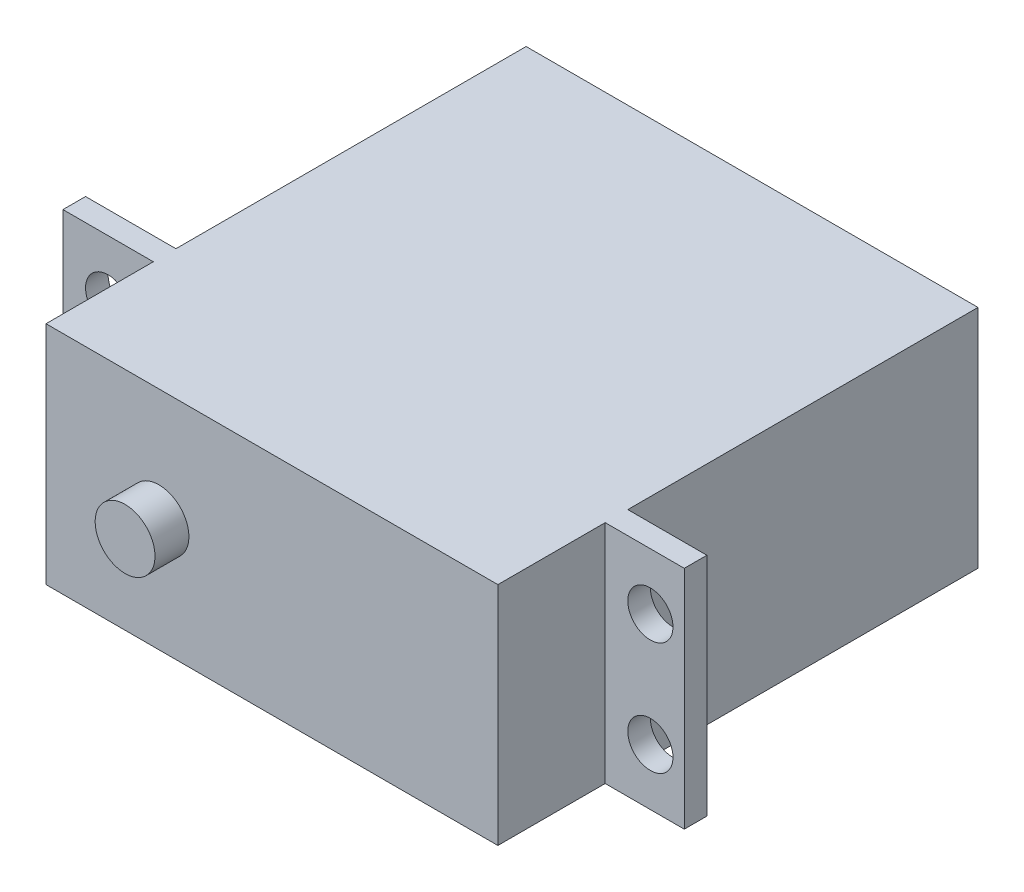
ISO-10303-21;
HEADER;
FILE_DESCRIPTION(('STEP AP214'),'2;1');
FILE_NAME('part.step','',(''),(''),'','','');
FILE_SCHEMA(('AUTOMOTIVE_DESIGN { 1 0 10303 214 1 1 1 1 }'));
ENDSEC;
DATA;
#1=APPLICATION_CONTEXT('core data for automotive mechanical design processes');
#2=APPLICATION_PROTOCOL_DEFINITION('international standard','automotive_design',2000,#1);
#3=PRODUCT_CONTEXT('',#1,'mechanical');
#4=PRODUCT('Part','Part','',(#3));
#5=PRODUCT_RELATED_PRODUCT_CATEGORY('part','',(#4));
#6=PRODUCT_DEFINITION_FORMATION('','',#4);
#7=PRODUCT_DEFINITION_CONTEXT('part definition',#1,'design');
#8=PRODUCT_DEFINITION('design','',#6,#7);
#9=PRODUCT_DEFINITION_SHAPE('','',#8);
#10=(LENGTH_UNIT() NAMED_UNIT(*) SI_UNIT(.MILLI.,.METRE.));
#11=(NAMED_UNIT(*) PLANE_ANGLE_UNIT() SI_UNIT($,.RADIAN.));
#12=(NAMED_UNIT(*) SI_UNIT($,.STERADIAN.) SOLID_ANGLE_UNIT());
#13=UNCERTAINTY_MEASURE_WITH_UNIT(LENGTH_MEASURE(1.E-05),#10,'distance_accuracy_value','');
#14=(GEOMETRIC_REPRESENTATION_CONTEXT(3) GLOBAL_UNCERTAINTY_ASSIGNED_CONTEXT((#13)) GLOBAL_UNIT_ASSIGNED_CONTEXT((#10,
#11,#12)) REPRESENTATION_CONTEXT('',''));
#15=CARTESIAN_POINT('',(0.,0.,0.));
#16=DIRECTION('',(0.,0.,1.));
#17=DIRECTION('',(1.,0.,0.));
#18=AXIS2_PLACEMENT_3D('',#15,#16,#17);
#19=CARTESIAN_POINT('',(-10.,-10.,-42.5));
#20=DIRECTION('',(-1.,0.,0.));
#21=DIRECTION('',(0.,0.,1.));
#22=AXIS2_PLACEMENT_3D('',#19,#20,#21);
#23=PLANE('',#22);
#24=DIRECTION('',(0.,-1.,0.));
#25=VECTOR('',#24,1.);
#26=CARTESIAN_POINT('',(-10.,-10.,-11.5));
#27=LINE('',#26,#25);
#28=CARTESIAN_POINT('',(-10.,10.,-11.5));
#29=VERTEX_POINT('',#28);
#30=CARTESIAN_POINT('',(-10.,-10.,-11.5));
#31=VERTEX_POINT('',#30);
#32=EDGE_CURVE('E186',#29,#31,#27,.T.);
#33=ORIENTED_EDGE('',*,*,#32,.F.);
#34=DIRECTION('',(0.,0.,1.));
#35=VECTOR('',#34,1.);
#36=CARTESIAN_POINT('',(-10.,10.,-42.5));
#37=LINE('',#36,#35);
#38=CARTESIAN_POINT('',(-10.,10.,-42.5));
#39=VERTEX_POINT('',#38);
#40=EDGE_CURVE('E11',#39,#29,#37,.T.);
#41=ORIENTED_EDGE('',*,*,#40,.F.);
#42=DIRECTION('',(0.,-1.,0.));
#43=VECTOR('',#42,1.);
#44=CARTESIAN_POINT('',(-10.,-10.,-42.5));
#45=LINE('',#44,#43);
#46=CARTESIAN_POINT('',(-10.,-10.,-42.5));
#47=VERTEX_POINT('',#46);
#48=EDGE_CURVE('E189',#39,#47,#45,.T.);
#49=ORIENTED_EDGE('',*,*,#48,.T.);
#50=DIRECTION('',(0.,0.,1.));
#51=VECTOR('',#50,1.);
#52=CARTESIAN_POINT('',(-10.,-10.,-42.5));
#53=LINE('',#52,#51);
#54=EDGE_CURVE('E218',#47,#31,#53,.T.);
#55=ORIENTED_EDGE('',*,*,#54,.T.);
#56=EDGE_LOOP('',(#33,#41,#49,#55));
#57=FACE_BOUND('',#56,.T.);
#58=ADVANCED_FACE('F38',(#57),#23,.T.);
#59=CARTESIAN_POINT('',(30.,-10.,-42.5));
#60=DIRECTION('',(1.,0.,0.));
#61=DIRECTION('',(0.,0.,-1.));
#62=AXIS2_PLACEMENT_3D('',#59,#60,#61);
#63=PLANE('',#62);
#64=DIRECTION('',(0.,1.,0.));
#65=VECTOR('',#64,1.);
#66=CARTESIAN_POINT('',(30.,-10.,-11.5));
#67=LINE('',#66,#65);
#68=CARTESIAN_POINT('',(30.,-10.,-11.5));
#69=VERTEX_POINT('',#68);
#70=CARTESIAN_POINT('',(30.,10.,-11.5));
#71=VERTEX_POINT('',#70);
#72=EDGE_CURVE('E135',#69,#71,#67,.T.);
#73=ORIENTED_EDGE('',*,*,#72,.F.);
#74=DIRECTION('',(0.,0.,1.));
#75=VECTOR('',#74,1.);
#76=CARTESIAN_POINT('',(30.,-10.,-42.5));
#77=LINE('',#76,#75);
#78=CARTESIAN_POINT('',(30.,-10.,-42.5));
#79=VERTEX_POINT('',#78);
#80=EDGE_CURVE('E214',#79,#69,#77,.T.);
#81=ORIENTED_EDGE('',*,*,#80,.F.);
#82=DIRECTION('',(0.,1.,0.));
#83=VECTOR('',#82,1.);
#84=CARTESIAN_POINT('',(30.,-10.,-42.5));
#85=LINE('',#84,#83);
#86=CARTESIAN_POINT('',(30.,10.,-42.5));
#87=VERTEX_POINT('',#86);
#88=EDGE_CURVE('E196',#79,#87,#85,.T.);
#89=ORIENTED_EDGE('',*,*,#88,.T.);
#90=DIRECTION('',(0.,0.,1.));
#91=VECTOR('',#90,1.);
#92=CARTESIAN_POINT('',(30.,10.,-42.5));
#93=LINE('',#92,#91);
#94=EDGE_CURVE('E63',#87,#71,#93,.T.);
#95=ORIENTED_EDGE('',*,*,#94,.T.);
#96=EDGE_LOOP('',(#73,#81,#89,#95));
#97=FACE_BOUND('',#96,.T.);
#98=ADVANCED_FACE('F260',(#97),#63,.T.);
#99=DIRECTION('',(0.,1.,0.));
#100=VECTOR('',#99,1.);
#101=CARTESIAN_POINT('',(-10.,-10.,-9.5));
#102=LINE('',#101,#100);
#103=CARTESIAN_POINT('',(-10.,-10.,-9.5));
#104=VERTEX_POINT('',#103);
#105=CARTESIAN_POINT('',(-10.,10.,-9.5));
#106=VERTEX_POINT('',#105);
#107=EDGE_CURVE('E183',#104,#106,#102,.T.);
#108=ORIENTED_EDGE('',*,*,#107,.F.);
#109=CARTESIAN_POINT('',(-10.,-10.,0.));
#110=VERTEX_POINT('',#109);
#111=EDGE_CURVE('E201',#104,#110,#53,.T.);
#112=ORIENTED_EDGE('',*,*,#111,.T.);
#113=DIRECTION('',(0.,-1.,0.));
#114=VECTOR('',#113,1.);
#115=CARTESIAN_POINT('',(-10.,-10.,0.));
#116=LINE('',#115,#114);
#117=CARTESIAN_POINT('',(-10.,10.,0.));
#118=VERTEX_POINT('',#117);
#119=EDGE_CURVE('E188',#118,#110,#116,.T.);
#120=ORIENTED_EDGE('',*,*,#119,.F.);
#121=EDGE_CURVE('E47',#106,#118,#37,.T.);
#122=ORIENTED_EDGE('',*,*,#121,.F.);
#123=EDGE_LOOP('',(#108,#112,#120,#122));
#124=FACE_BOUND('',#123,.T.);
#125=ADVANCED_FACE('F40',(#124),#23,.T.);
#126=CARTESIAN_POINT('',(-10.,10.,-42.5));
#127=DIRECTION('',(0.,1.,0.));
#128=DIRECTION('',(0.,0.,1.));
#129=AXIS2_PLACEMENT_3D('',#126,#127,#128);
#130=PLANE('',#129);
#131=CARTESIAN_POINT('',(30.,10.,-9.5));
#132=VERTEX_POINT('',#131);
#133=CARTESIAN_POINT('',(30.,10.,0.));
#134=VERTEX_POINT('',#133);
#135=EDGE_CURVE('E213',#132,#134,#93,.T.);
#136=ORIENTED_EDGE('',*,*,#135,.F.);
#137=DIRECTION('',(1.,0.,0.));
#138=VECTOR('',#137,1.);
#139=CARTESIAN_POINT('',(-18.,10.,-9.5));
#140=LINE('',#139,#138);
#141=CARTESIAN_POINT('',(37.,10.,-9.5));
#142=VERTEX_POINT('',#141);
#143=EDGE_CURVE('E143',#132,#142,#140,.T.);
#144=ORIENTED_EDGE('',*,*,#143,.T.);
#145=DIRECTION('',(0.,0.,1.));
#146=VECTOR('',#145,1.);
#147=CARTESIAN_POINT('',(37.,10.,-11.5));
#148=LINE('',#147,#146);
#149=CARTESIAN_POINT('',(37.,10.,-11.5));
#150=VERTEX_POINT('',#149);
#151=EDGE_CURVE('E140',#150,#142,#148,.T.);
#152=ORIENTED_EDGE('',*,*,#151,.F.);
#153=DIRECTION('',(1.,0.,0.));
#154=VECTOR('',#153,1.);
#155=CARTESIAN_POINT('',(-18.,10.,-11.5));
#156=LINE('',#155,#154);
#157=EDGE_CURVE('E129',#71,#150,#156,.T.);
#158=ORIENTED_EDGE('',*,*,#157,.F.);
#159=ORIENTED_EDGE('',*,*,#94,.F.);
#160=DIRECTION('',(-1.,0.,0.));
#161=VECTOR('',#160,1.);
#162=CARTESIAN_POINT('',(-10.,10.,-42.5));
#163=LINE('',#162,#161);
#164=EDGE_CURVE('E198',#87,#39,#163,.T.);
#165=ORIENTED_EDGE('',*,*,#164,.T.);
#166=ORIENTED_EDGE('',*,*,#40,.T.);
#167=CARTESIAN_POINT('',(-18.,10.,-11.5));
#168=VERTEX_POINT('',#167);
#169=EDGE_CURVE('E136',#168,#29,#156,.T.);
#170=ORIENTED_EDGE('',*,*,#169,.F.);
#171=DIRECTION('',(0.,0.,1.));
#172=VECTOR('',#171,1.);
#173=CARTESIAN_POINT('',(-18.,10.,-11.5));
#174=LINE('',#173,#172);
#175=CARTESIAN_POINT('',(-18.,10.,-9.5));
#176=VERTEX_POINT('',#175);
#177=EDGE_CURVE('E165',#168,#176,#174,.T.);
#178=ORIENTED_EDGE('',*,*,#177,.T.);
#179=EDGE_CURVE('E55',#176,#106,#140,.T.);
#180=ORIENTED_EDGE('',*,*,#179,.T.);
#181=ORIENTED_EDGE('',*,*,#121,.T.);
#182=DIRECTION('',(-1.,0.,0.));
#183=VECTOR('',#182,1.);
#184=CARTESIAN_POINT('',(-10.,10.,0.));
#185=LINE('',#184,#183);
#186=EDGE_CURVE('E193',#134,#118,#185,.T.);
#187=ORIENTED_EDGE('',*,*,#186,.F.);
#188=EDGE_LOOP('',(#136,#144,#152,#158,#159,#165,#166,#170,#178,#180,#181,#187));
#189=FACE_BOUND('',#188,.T.);
#190=ADVANCED_FACE('F141',(#189),#130,.T.);
#191=DIRECTION('',(0.,-1.,0.));
#192=VECTOR('',#191,1.);
#193=CARTESIAN_POINT('',(30.,-10.,-9.5));
#194=LINE('',#193,#192);
#195=CARTESIAN_POINT('',(30.,-10.,-9.5));
#196=VERTEX_POINT('',#195);
#197=EDGE_CURVE('E175',#132,#196,#194,.T.);
#198=ORIENTED_EDGE('',*,*,#197,.F.);
#199=ORIENTED_EDGE('',*,*,#135,.T.);
#200=DIRECTION('',(0.,1.,0.));
#201=VECTOR('',#200,1.);
#202=CARTESIAN_POINT('',(30.,-10.,0.));
#203=LINE('',#202,#201);
#204=CARTESIAN_POINT('',(30.,-10.,0.));
#205=VERTEX_POINT('',#204);
#206=EDGE_CURVE('E207',#205,#134,#203,.T.);
#207=ORIENTED_EDGE('',*,*,#206,.F.);
#208=EDGE_CURVE('E217',#196,#205,#77,.T.);
#209=ORIENTED_EDGE('',*,*,#208,.F.);
#210=EDGE_LOOP('',(#198,#199,#207,#209));
#211=FACE_BOUND('',#210,.T.);
#212=ADVANCED_FACE('F266',(#211),#63,.T.);
#213=CARTESIAN_POINT('',(-10.,-10.,-42.5));
#214=DIRECTION('',(0.,-1.,0.));
#215=DIRECTION('',(0.,0.,-1.));
#216=AXIS2_PLACEMENT_3D('',#213,#214,#215);
#217=PLANE('',#216);
#218=ORIENTED_EDGE('',*,*,#111,.F.);
#219=DIRECTION('',(1.,0.,0.));
#220=VECTOR('',#219,1.);
#221=CARTESIAN_POINT('',(-18.,-10.,-9.5));
#222=LINE('',#221,#220);
#223=CARTESIAN_POINT('',(-18.,-10.,-9.5));
#224=VERTEX_POINT('',#223);
#225=EDGE_CURVE('E177',#224,#104,#222,.T.);
#226=ORIENTED_EDGE('',*,*,#225,.F.);
#227=DIRECTION('',(0.,0.,-1.));
#228=VECTOR('',#227,1.);
#229=CARTESIAN_POINT('',(-18.,-10.,-11.5));
#230=LINE('',#229,#228);
#231=CARTESIAN_POINT('',(-18.,-10.,-11.5));
#232=VERTEX_POINT('',#231);
#233=EDGE_CURVE('E137',#224,#232,#230,.T.);
#234=ORIENTED_EDGE('',*,*,#233,.T.);
#235=DIRECTION('',(1.,0.,0.));
#236=VECTOR('',#235,1.);
#237=CARTESIAN_POINT('',(-18.,-10.,-11.5));
#238=LINE('',#237,#236);
#239=EDGE_CURVE('E172',#232,#31,#238,.T.);
#240=ORIENTED_EDGE('',*,*,#239,.T.);
#241=ORIENTED_EDGE('',*,*,#54,.F.);
#242=DIRECTION('',(1.,0.,0.));
#243=VECTOR('',#242,1.);
#244=CARTESIAN_POINT('',(-10.,-10.,-42.5));
#245=LINE('',#244,#243);
#246=EDGE_CURVE('E192',#47,#79,#245,.T.);
#247=ORIENTED_EDGE('',*,*,#246,.T.);
#248=ORIENTED_EDGE('',*,*,#80,.T.);
#249=CARTESIAN_POINT('',(37.,-10.,-11.5));
#250=VERTEX_POINT('',#249);
#251=EDGE_CURVE('E176',#69,#250,#238,.T.);
#252=ORIENTED_EDGE('',*,*,#251,.T.);
#253=DIRECTION('',(0.,0.,-1.));
#254=VECTOR('',#253,1.);
#255=CARTESIAN_POINT('',(37.,-10.,-11.5));
#256=LINE('',#255,#254);
#257=CARTESIAN_POINT('',(37.,-10.,-9.5));
#258=VERTEX_POINT('',#257);
#259=EDGE_CURVE('E152',#258,#250,#256,.T.);
#260=ORIENTED_EDGE('',*,*,#259,.F.);
#261=EDGE_CURVE('E179',#196,#258,#222,.T.);
#262=ORIENTED_EDGE('',*,*,#261,.F.);
#263=ORIENTED_EDGE('',*,*,#208,.T.);
#264=DIRECTION('',(1.,0.,0.));
#265=VECTOR('',#264,1.);
#266=CARTESIAN_POINT('',(-10.,-10.,0.));
#267=LINE('',#266,#265);
#268=EDGE_CURVE('E204',#110,#205,#267,.T.);
#269=ORIENTED_EDGE('',*,*,#268,.F.);
#270=EDGE_LOOP('',(#218,#226,#234,#240,#241,#247,#248,#252,#260,#262,#263,#269));
#271=FACE_BOUND('',#270,.T.);
#272=ADVANCED_FACE('F281',(#271),#217,.T.);
#273=CARTESIAN_POINT('',(0.,0.,-42.5));
#274=DIRECTION('',(0.,0.,-1.));
#275=DIRECTION('',(-1.,0.,0.));
#276=AXIS2_PLACEMENT_3D('',#273,#274,#275);
#277=PLANE('',#276);
#278=ORIENTED_EDGE('',*,*,#48,.F.);
#279=ORIENTED_EDGE('',*,*,#164,.F.);
#280=ORIENTED_EDGE('',*,*,#88,.F.);
#281=ORIENTED_EDGE('',*,*,#246,.F.);
#282=EDGE_LOOP('',(#278,#279,#280,#281));
#283=FACE_BOUND('',#282,.T.);
#284=ADVANCED_FACE('F296',(#283),#277,.T.);
#285=CARTESIAN_POINT('',(0.,0.,0.));
#286=DIRECTION('',(0.,0.,-1.));
#287=DIRECTION('',(-1.,0.,0.));
#288=AXIS2_PLACEMENT_3D('',#285,#286,#287);
#289=PLANE('',#288);
#290=CARTESIAN_POINT('',(0.,0.,0.));
#291=DIRECTION('',(0.,0.,-1.));
#292=DIRECTION('',(-1.,0.,0.));
#293=AXIS2_PLACEMENT_3D('',#290,#291,#292);
#294=CIRCLE('',#293,2.65);
#295=CARTESIAN_POINT('',(-2.65,0.,0.));
#296=VERTEX_POINT('',#295);
#297=EDGE_CURVE('E242',#296,#296,#294,.T.);
#298=ORIENTED_EDGE('',*,*,#297,.T.);
#299=EDGE_LOOP('',(#298));
#300=FACE_BOUND('',#299,.T.);
#301=ORIENTED_EDGE('',*,*,#119,.T.);
#302=ORIENTED_EDGE('',*,*,#268,.T.);
#303=ORIENTED_EDGE('',*,*,#206,.T.);
#304=ORIENTED_EDGE('',*,*,#186,.T.);
#305=EDGE_LOOP('',(#301,#302,#303,#304));
#306=FACE_BOUND('',#305,.T.);
#307=ADVANCED_FACE('F285',(#300,#306),#289,.F.);
#308=CARTESIAN_POINT('',(37.,0.,0.));
#309=DIRECTION('',(-1.,0.,0.));
#310=DIRECTION('',(0.,0.,1.));
#311=AXIS2_PLACEMENT_3D('',#308,#309,#310);
#312=PLANE('',#311);
#313=DIRECTION('',(0.,1.,0.));
#314=VECTOR('',#313,1.);
#315=CARTESIAN_POINT('',(37.,10.,-11.5));
#316=LINE('',#315,#314);
#317=EDGE_CURVE('E134',#250,#150,#316,.T.);
#318=ORIENTED_EDGE('',*,*,#317,.T.);
#319=ORIENTED_EDGE('',*,*,#151,.T.);
#320=DIRECTION('',(0.,-1.,0.));
#321=VECTOR('',#320,1.);
#322=CARTESIAN_POINT('',(37.,10.,-9.5));
#323=LINE('',#322,#321);
#324=EDGE_CURVE('E147',#142,#258,#323,.T.);
#325=ORIENTED_EDGE('',*,*,#324,.T.);
#326=ORIENTED_EDGE('',*,*,#259,.T.);
#327=EDGE_LOOP('',(#318,#319,#325,#326));
#328=FACE_BOUND('',#327,.T.);
#329=ADVANCED_FACE('F150',(#328),#312,.F.);
#330=CARTESIAN_POINT('',(-18.,10.,-9.5));
#331=DIRECTION('',(0.,0.,1.));
#332=DIRECTION('',(0.,-1.,0.));
#333=AXIS2_PLACEMENT_3D('',#330,#331,#332);
#334=PLANE('',#333);
#335=CARTESIAN_POINT('',(34.,5.,-9.5));
#336=DIRECTION('',(0.,0.,1.));
#337=DIRECTION('',(0.,-1.,0.));
#338=AXIS2_PLACEMENT_3D('',#335,#336,#337);
#339=CIRCLE('',#338,2.);
#340=CARTESIAN_POINT('',(34.,3.,-9.5));
#341=VERTEX_POINT('',#340);
#342=EDGE_CURVE('E235',#341,#341,#339,.T.);
#343=ORIENTED_EDGE('',*,*,#342,.F.);
#344=EDGE_LOOP('',(#343));
#345=FACE_BOUND('',#344,.T.);
#346=CARTESIAN_POINT('',(34.,-5.,-9.5));
#347=DIRECTION('',(0.,0.,1.));
#348=DIRECTION('',(0.,-1.,0.));
#349=AXIS2_PLACEMENT_3D('',#346,#347,#348);
#350=CIRCLE('',#349,2.);
#351=CARTESIAN_POINT('',(34.,-7.,-9.5));
#352=VERTEX_POINT('',#351);
#353=EDGE_CURVE('E153',#352,#352,#350,.T.);
#354=ORIENTED_EDGE('',*,*,#353,.F.);
#355=EDGE_LOOP('',(#354));
#356=FACE_BOUND('',#355,.T.);
#357=ORIENTED_EDGE('',*,*,#143,.F.);
#358=ORIENTED_EDGE('',*,*,#197,.T.);
#359=ORIENTED_EDGE('',*,*,#261,.T.);
#360=ORIENTED_EDGE('',*,*,#324,.F.);
#361=EDGE_LOOP('',(#357,#358,#359,#360));
#362=FACE_BOUND('',#361,.T.);
#363=ADVANCED_FACE('F290',(#345,#356,#362),#334,.T.);
#364=CARTESIAN_POINT('',(-18.,10.,-11.5));
#365=DIRECTION('',(0.,0.,-1.));
#366=DIRECTION('',(0.,1.,0.));
#367=AXIS2_PLACEMENT_3D('',#364,#365,#366);
#368=PLANE('',#367);
#369=CARTESIAN_POINT('',(34.,5.,-11.5));
#370=DIRECTION('',(0.,0.,-1.));
#371=DIRECTION('',(-1.,0.,0.));
#372=AXIS2_PLACEMENT_3D('',#369,#370,#371);
#373=CIRCLE('',#372,2.);
#374=CARTESIAN_POINT('',(32.,5.,-11.5));
#375=VERTEX_POINT('',#374);
#376=EDGE_CURVE('E238',#375,#375,#373,.T.);
#377=ORIENTED_EDGE('',*,*,#376,.F.);
#378=EDGE_LOOP('',(#377));
#379=FACE_BOUND('',#378,.T.);
#380=CARTESIAN_POINT('',(34.,-5.,-11.5));
#381=DIRECTION('',(0.,0.,-1.));
#382=DIRECTION('',(1.,0.,0.));
#383=AXIS2_PLACEMENT_3D('',#380,#381,#382);
#384=CIRCLE('',#383,2.);
#385=CARTESIAN_POINT('',(36.,-5.,-11.5));
#386=VERTEX_POINT('',#385);
#387=EDGE_CURVE('E156',#386,#386,#384,.T.);
#388=ORIENTED_EDGE('',*,*,#387,.F.);
#389=EDGE_LOOP('',(#388));
#390=FACE_BOUND('',#389,.T.);
#391=ORIENTED_EDGE('',*,*,#251,.F.);
#392=ORIENTED_EDGE('',*,*,#72,.T.);
#393=ORIENTED_EDGE('',*,*,#157,.T.);
#394=ORIENTED_EDGE('',*,*,#317,.F.);
#395=EDGE_LOOP('',(#391,#392,#393,#394));
#396=FACE_BOUND('',#395,.T.);
#397=ADVANCED_FACE('F132',(#379,#390,#396),#368,.T.);
#398=CARTESIAN_POINT('',(-14.,5.,-11.5));
#399=DIRECTION('',(0.,0.,-1.));
#400=DIRECTION('',(1.,0.,0.));
#401=AXIS2_PLACEMENT_3D('',#398,#399,#400);
#402=CIRCLE('',#401,2.);
#403=CARTESIAN_POINT('',(-12.,5.,-11.5));
#404=VERTEX_POINT('',#403);
#405=EDGE_CURVE('E231',#404,#404,#402,.T.);
#406=ORIENTED_EDGE('',*,*,#405,.F.);
#407=EDGE_LOOP('',(#406));
#408=FACE_BOUND('',#407,.T.);
#409=CARTESIAN_POINT('',(-14.,-5.,-11.5));
#410=DIRECTION('',(0.,0.,-1.));
#411=DIRECTION('',(-1.,0.,0.));
#412=AXIS2_PLACEMENT_3D('',#409,#410,#411);
#413=CIRCLE('',#412,2.);
#414=CARTESIAN_POINT('',(-16.,-5.,-11.5));
#415=VERTEX_POINT('',#414);
#416=EDGE_CURVE('E222',#415,#415,#413,.T.);
#417=ORIENTED_EDGE('',*,*,#416,.F.);
#418=EDGE_LOOP('',(#417));
#419=FACE_BOUND('',#418,.T.);
#420=ORIENTED_EDGE('',*,*,#169,.T.);
#421=ORIENTED_EDGE('',*,*,#32,.T.);
#422=ORIENTED_EDGE('',*,*,#239,.F.);
#423=DIRECTION('',(0.,1.,0.));
#424=VECTOR('',#423,1.);
#425=CARTESIAN_POINT('',(-18.,10.,-11.5));
#426=LINE('',#425,#424);
#427=EDGE_CURVE('E162',#232,#168,#426,.T.);
#428=ORIENTED_EDGE('',*,*,#427,.T.);
#429=EDGE_LOOP('',(#420,#421,#422,#428));
#430=FACE_BOUND('',#429,.T.);
#431=ADVANCED_FACE('F299',(#408,#419,#430),#368,.T.);
#432=CARTESIAN_POINT('',(-14.,5.,-9.5));
#433=DIRECTION('',(0.,0.,1.));
#434=DIRECTION('',(0.,-1.,0.));
#435=AXIS2_PLACEMENT_3D('',#432,#433,#434);
#436=CIRCLE('',#435,2.);
#437=CARTESIAN_POINT('',(-14.,3.,-9.5));
#438=VERTEX_POINT('',#437);
#439=EDGE_CURVE('E42',#438,#438,#436,.T.);
#440=ORIENTED_EDGE('',*,*,#439,.F.);
#441=EDGE_LOOP('',(#440));
#442=FACE_BOUND('',#441,.T.);
#443=CARTESIAN_POINT('',(-14.,-5.,-9.5));
#444=DIRECTION('',(0.,0.,1.));
#445=DIRECTION('',(0.,-1.,0.));
#446=AXIS2_PLACEMENT_3D('',#443,#444,#445);
#447=CIRCLE('',#446,2.);
#448=CARTESIAN_POINT('',(-14.,-7.,-9.5));
#449=VERTEX_POINT('',#448);
#450=EDGE_CURVE('E220',#449,#449,#447,.T.);
#451=ORIENTED_EDGE('',*,*,#450,.F.);
#452=EDGE_LOOP('',(#451));
#453=FACE_BOUND('',#452,.T.);
#454=ORIENTED_EDGE('',*,*,#225,.T.);
#455=ORIENTED_EDGE('',*,*,#107,.T.);
#456=ORIENTED_EDGE('',*,*,#179,.F.);
#457=DIRECTION('',(0.,-1.,0.));
#458=VECTOR('',#457,1.);
#459=CARTESIAN_POINT('',(-18.,10.,-9.5));
#460=LINE('',#459,#458);
#461=EDGE_CURVE('E167',#176,#224,#460,.T.);
#462=ORIENTED_EDGE('',*,*,#461,.T.);
#463=EDGE_LOOP('',(#454,#455,#456,#462));
#464=FACE_BOUND('',#463,.T.);
#465=ADVANCED_FACE('F305',(#442,#453,#464),#334,.T.);
#466=CARTESIAN_POINT('',(-18.,0.,0.));
#467=DIRECTION('',(-1.,0.,0.));
#468=DIRECTION('',(0.,0.,1.));
#469=AXIS2_PLACEMENT_3D('',#466,#467,#468);
#470=PLANE('',#469);
#471=ORIENTED_EDGE('',*,*,#427,.F.);
#472=ORIENTED_EDGE('',*,*,#233,.F.);
#473=ORIENTED_EDGE('',*,*,#461,.F.);
#474=ORIENTED_EDGE('',*,*,#177,.F.);
#475=EDGE_LOOP('',(#471,#472,#473,#474));
#476=FACE_BOUND('',#475,.T.);
#477=ADVANCED_FACE('F304',(#476),#470,.T.);
#478=CARTESIAN_POINT('',(34.,-5.,-4.));
#479=DIRECTION('',(0.,0.,-1.));
#480=DIRECTION('',(-1.,0.,0.));
#481=AXIS2_PLACEMENT_3D('',#478,#479,#480);
#482=CYLINDRICAL_SURFACE('',#481,2.);
#483=ORIENTED_EDGE('',*,*,#353,.T.);
#484=EDGE_LOOP('',(#483));
#485=FACE_BOUND('',#484,.T.);
#486=ORIENTED_EDGE('',*,*,#387,.T.);
#487=EDGE_LOOP('',(#486));
#488=FACE_BOUND('',#487,.T.);
#489=ADVANCED_FACE('F313',(#485,#488),#482,.F.);
#490=CARTESIAN_POINT('',(-14.,-5.,-4.));
#491=DIRECTION('',(0.,0.,-1.));
#492=DIRECTION('',(-1.,0.,0.));
#493=AXIS2_PLACEMENT_3D('',#490,#491,#492);
#494=CYLINDRICAL_SURFACE('',#493,2.);
#495=ORIENTED_EDGE('',*,*,#450,.T.);
#496=EDGE_LOOP('',(#495));
#497=FACE_BOUND('',#496,.T.);
#498=ORIENTED_EDGE('',*,*,#416,.T.);
#499=EDGE_LOOP('',(#498));
#500=FACE_BOUND('',#499,.T.);
#501=ADVANCED_FACE('F333',(#497,#500),#494,.F.);
#502=CARTESIAN_POINT('',(-14.,5.,-4.));
#503=DIRECTION('',(0.,0.,-1.));
#504=DIRECTION('',(-1.,0.,0.));
#505=AXIS2_PLACEMENT_3D('',#502,#503,#504);
#506=CYLINDRICAL_SURFACE('',#505,2.);
#507=ORIENTED_EDGE('',*,*,#439,.T.);
#508=EDGE_LOOP('',(#507));
#509=FACE_BOUND('',#508,.T.);
#510=ORIENTED_EDGE('',*,*,#405,.T.);
#511=EDGE_LOOP('',(#510));
#512=FACE_BOUND('',#511,.T.);
#513=ADVANCED_FACE('F340',(#509,#512),#506,.F.);
#514=CARTESIAN_POINT('',(34.,5.,-4.));
#515=DIRECTION('',(0.,0.,-1.));
#516=DIRECTION('',(-1.,0.,0.));
#517=AXIS2_PLACEMENT_3D('',#514,#515,#516);
#518=CYLINDRICAL_SURFACE('',#517,2.);
#519=ORIENTED_EDGE('',*,*,#342,.T.);
#520=EDGE_LOOP('',(#519));
#521=FACE_BOUND('',#520,.T.);
#522=ORIENTED_EDGE('',*,*,#376,.T.);
#523=EDGE_LOOP('',(#522));
#524=FACE_BOUND('',#523,.T.);
#525=ADVANCED_FACE('F257',(#521,#524),#518,.F.);
#526=CARTESIAN_POINT('',(0.,0.,3.));
#527=DIRECTION('',(0.,0.,-1.));
#528=DIRECTION('',(-1.,0.,0.));
#529=AXIS2_PLACEMENT_3D('',#526,#527,#528);
#530=CYLINDRICAL_SURFACE('',#529,2.65);
#531=CARTESIAN_POINT('',(0.,0.,3.));
#532=DIRECTION('',(0.,0.,-1.));
#533=DIRECTION('',(-1.,0.,0.));
#534=AXIS2_PLACEMENT_3D('',#531,#532,#533);
#535=CIRCLE('',#534,2.65);
#536=CARTESIAN_POINT('',(-2.65,0.,3.));
#537=VERTEX_POINT('',#536);
#538=EDGE_CURVE('E241',#537,#537,#535,.T.);
#539=ORIENTED_EDGE('',*,*,#538,.T.);
#540=EDGE_LOOP('',(#539));
#541=FACE_BOUND('',#540,.T.);
#542=ORIENTED_EDGE('',*,*,#297,.F.);
#543=EDGE_LOOP('',(#542));
#544=FACE_BOUND('',#543,.T.);
#545=ADVANCED_FACE('F248',(#541,#544),#530,.T.);
#546=CARTESIAN_POINT('',(0.,0.,3.));
#547=DIRECTION('',(0.,0.,-1.));
#548=DIRECTION('',(-1.,0.,0.));
#549=AXIS2_PLACEMENT_3D('',#546,#547,#548);
#550=PLANE('',#549);
#551=ORIENTED_EDGE('',*,*,#538,.F.);
#552=EDGE_LOOP('',(#551));
#553=FACE_BOUND('',#552,.T.);
#554=ADVANCED_FACE('F251',(#553),#550,.F.);
#555=CLOSED_SHELL('',(#58,#98,#125,#190,#212,#272,#284,#307,#329,#363,#397,#431,#465,#477,#489,
#501,#513,#525,#545,#554));
#556=MANIFOLD_SOLID_BREP('B2',#555);
#557=ADVANCED_BREP_SHAPE_REPRESENTATION('',(#18,#556),#14);
#558=SHAPE_DEFINITION_REPRESENTATION(#9,#557);
ENDSEC;
END-ISO-10303-21;
